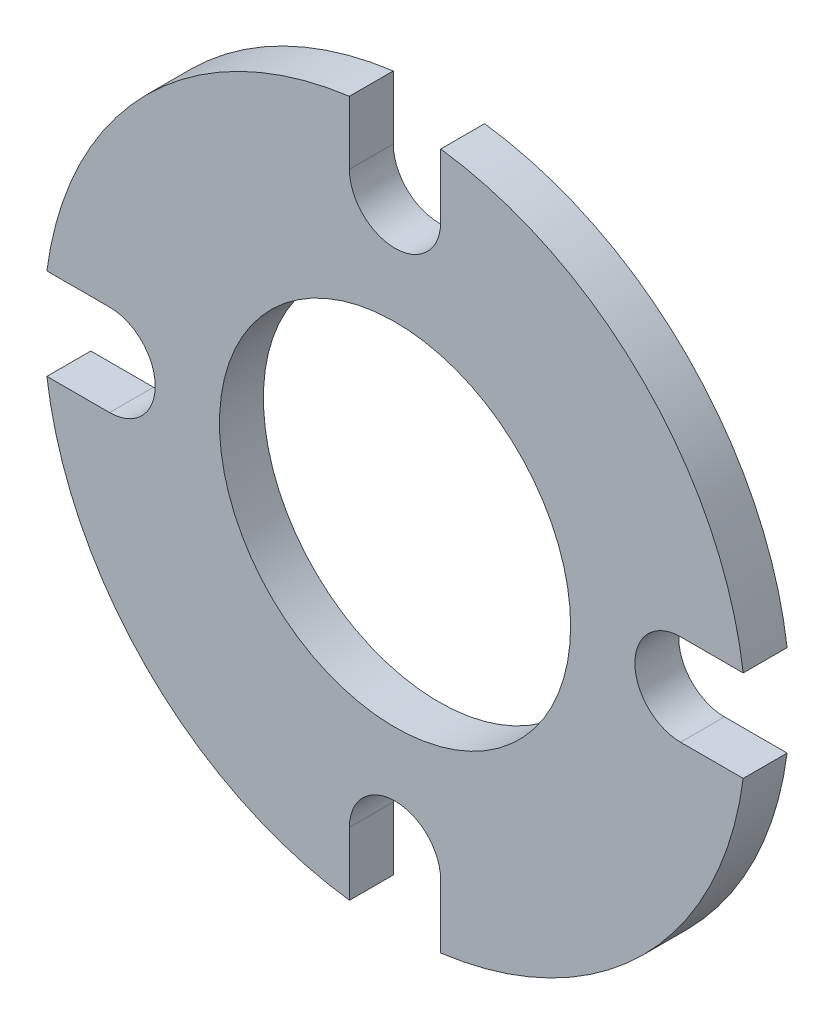
ISO-10303-21;
HEADER;
FILE_DESCRIPTION(('STEP AP214'),'2;1');
FILE_NAME('part.step','',(''),(''),'','','');
FILE_SCHEMA(('AUTOMOTIVE_DESIGN { 1 0 10303 214 1 1 1 1 }'));
ENDSEC;
DATA;
#1=APPLICATION_CONTEXT('core data for automotive mechanical design processes');
#2=APPLICATION_PROTOCOL_DEFINITION('international standard','automotive_design',2000,#1);
#3=PRODUCT_CONTEXT('',#1,'mechanical');
#4=PRODUCT('Part','Part','',(#3));
#5=PRODUCT_RELATED_PRODUCT_CATEGORY('part','',(#4));
#6=PRODUCT_DEFINITION_FORMATION('','',#4);
#7=PRODUCT_DEFINITION_CONTEXT('part definition',#1,'design');
#8=PRODUCT_DEFINITION('design','',#6,#7);
#9=PRODUCT_DEFINITION_SHAPE('','',#8);
#10=(LENGTH_UNIT() NAMED_UNIT(*) SI_UNIT(.MILLI.,.METRE.));
#11=(NAMED_UNIT(*) PLANE_ANGLE_UNIT() SI_UNIT($,.RADIAN.));
#12=(NAMED_UNIT(*) SI_UNIT($,.STERADIAN.) SOLID_ANGLE_UNIT());
#13=UNCERTAINTY_MEASURE_WITH_UNIT(LENGTH_MEASURE(1.E-05),#10,'distance_accuracy_value','');
#14=(GEOMETRIC_REPRESENTATION_CONTEXT(3) GLOBAL_UNCERTAINTY_ASSIGNED_CONTEXT((#13)) GLOBAL_UNIT_ASSIGNED_CONTEXT((#10,
#11,#12)) REPRESENTATION_CONTEXT('',''));
#15=CARTESIAN_POINT('',(0.,0.,0.));
#16=DIRECTION('',(0.,0.,1.));
#17=DIRECTION('',(1.,0.,0.));
#18=AXIS2_PLACEMENT_3D('',#15,#16,#17);
#19=CARTESIAN_POINT('',(-0.813,0.,0.0625));
#20=DIRECTION('',(0.,0.,-1.));
#21=DIRECTION('',(-1.,0.,0.));
#22=AXIS2_PLACEMENT_3D('',#19,#20,#21);
#23=PLANE('',#22);
#24=CARTESIAN_POINT('',(-0.813,0.,0.0625));
#25=DIRECTION('',(0.,0.,-1.));
#26=DIRECTION('',(-1.,0.,0.));
#27=AXIS2_PLACEMENT_3D('',#24,#25,#26);
#28=CIRCLE('',#27,0.13);
#29=CARTESIAN_POINT('',(-0.813,0.13,0.0625));
#30=VERTEX_POINT('',#29);
#31=CARTESIAN_POINT('',(-0.813,-0.13,0.0625));
#32=VERTEX_POINT('',#31);
#33=EDGE_CURVE('E213',#30,#32,#28,.T.);
#34=ORIENTED_EDGE('',*,*,#33,.T.);
#35=DIRECTION('',(-1.,0.,0.));
#36=VECTOR('',#35,1.);
#37=CARTESIAN_POINT('',(-0.813,-0.13,0.0625));
#38=LINE('',#37,#36);
#39=CARTESIAN_POINT('',(-0.991513993849809,-0.13,0.0625));
#40=VERTEX_POINT('',#39);
#41=EDGE_CURVE('E121',#32,#40,#38,.T.);
#42=ORIENTED_EDGE('',*,*,#41,.T.);
#43=CARTESIAN_POINT('',(0.,0.,0.0625));
#44=DIRECTION('',(0.,0.,1.));
#45=DIRECTION('',(1.,0.,0.));
#46=AXIS2_PLACEMENT_3D('',#43,#44,#45);
#47=CIRCLE('',#46,1.);
#48=CARTESIAN_POINT('',(-0.130000000000001,-0.991513993849809,0.0625));
#49=VERTEX_POINT('',#48);
#50=EDGE_CURVE('E252',#40,#49,#47,.T.);
#51=ORIENTED_EDGE('',*,*,#50,.T.);
#52=DIRECTION('',(0.,1.,0.));
#53=VECTOR('',#52,1.);
#54=CARTESIAN_POINT('',(-0.13,-0.991513993849809,0.0625));
#55=LINE('',#54,#53);
#56=CARTESIAN_POINT('',(-0.13,-0.811513993849809,0.0625));
#57=VERTEX_POINT('',#56);
#58=EDGE_CURVE('E271',#49,#57,#55,.T.);
#59=ORIENTED_EDGE('',*,*,#58,.T.);
#60=CARTESIAN_POINT('',(0.,-0.811513993849809,0.0625));
#61=DIRECTION('',(0.,0.,-1.));
#62=DIRECTION('',(-1.,0.,0.));
#63=AXIS2_PLACEMENT_3D('',#60,#61,#62);
#64=CIRCLE('',#63,0.13);
#65=CARTESIAN_POINT('',(0.13,-0.811513993849809,0.0625));
#66=VERTEX_POINT('',#65);
#67=EDGE_CURVE('E268',#57,#66,#64,.T.);
#68=ORIENTED_EDGE('',*,*,#67,.T.);
#69=DIRECTION('',(0.,-1.,0.));
#70=VECTOR('',#69,1.);
#71=CARTESIAN_POINT('',(0.13,-0.991513993849809,0.0625));
#72=LINE('',#71,#70);
#73=CARTESIAN_POINT('',(0.13,-0.991513993849809,0.0625));
#74=VERTEX_POINT('',#73);
#75=EDGE_CURVE('E270',#66,#74,#72,.T.);
#76=ORIENTED_EDGE('',*,*,#75,.T.);
#77=CARTESIAN_POINT('',(0.,0.,0.0625));
#78=DIRECTION('',(0.,0.,1.));
#79=DIRECTION('',(1.,0.,0.));
#80=AXIS2_PLACEMENT_3D('',#77,#78,#79);
#81=CIRCLE('',#80,1.);
#82=CARTESIAN_POINT('',(0.991513993849809,-0.130000000000001,0.0625));
#83=VERTEX_POINT('',#82);
#84=EDGE_CURVE('E273',#74,#83,#81,.T.);
#85=ORIENTED_EDGE('',*,*,#84,.T.);
#86=DIRECTION('',(-1.,0.,0.));
#87=VECTOR('',#86,1.);
#88=CARTESIAN_POINT('',(0.813,-0.13,0.0625));
#89=LINE('',#88,#87);
#90=CARTESIAN_POINT('',(0.813,-0.13,0.0625));
#91=VERTEX_POINT('',#90);
#92=EDGE_CURVE('E279',#83,#91,#89,.T.);
#93=ORIENTED_EDGE('',*,*,#92,.T.);
#94=CARTESIAN_POINT('',(0.813,0.,0.0625));
#95=DIRECTION('',(0.,0.,-1.));
#96=DIRECTION('',(1.,0.,0.));
#97=AXIS2_PLACEMENT_3D('',#94,#95,#96);
#98=CIRCLE('',#97,0.13);
#99=CARTESIAN_POINT('',(0.813,0.13,0.0625));
#100=VERTEX_POINT('',#99);
#101=EDGE_CURVE('E281',#91,#100,#98,.T.);
#102=ORIENTED_EDGE('',*,*,#101,.T.);
#103=DIRECTION('',(1.,0.,0.));
#104=VECTOR('',#103,1.);
#105=CARTESIAN_POINT('',(0.99151399384981,0.13,0.0625));
#106=LINE('',#105,#104);
#107=CARTESIAN_POINT('',(0.99151399384981,0.13,0.0625));
#108=VERTEX_POINT('',#107);
#109=EDGE_CURVE('E283',#100,#108,#106,.T.);
#110=ORIENTED_EDGE('',*,*,#109,.T.);
#111=CARTESIAN_POINT('',(0.,0.,0.0625));
#112=DIRECTION('',(0.,0.,1.));
#113=DIRECTION('',(1.,0.,0.));
#114=AXIS2_PLACEMENT_3D('',#111,#112,#113);
#115=CIRCLE('',#114,1.);
#116=CARTESIAN_POINT('',(0.13,0.991513993849809,0.0625));
#117=VERTEX_POINT('',#116);
#118=EDGE_CURVE('E285',#108,#117,#115,.T.);
#119=ORIENTED_EDGE('',*,*,#118,.T.);
#120=DIRECTION('',(0.,-1.,0.));
#121=VECTOR('',#120,1.);
#122=CARTESIAN_POINT('',(0.13,0.991513993849809,0.0625));
#123=LINE('',#122,#121);
#124=CARTESIAN_POINT('',(0.13,0.811513993849809,0.0625));
#125=VERTEX_POINT('',#124);
#126=EDGE_CURVE('E287',#117,#125,#123,.T.);
#127=ORIENTED_EDGE('',*,*,#126,.T.);
#128=CARTESIAN_POINT('',(0.,0.811513993849809,0.0625));
#129=DIRECTION('',(0.,0.,-1.));
#130=DIRECTION('',(1.,0.,0.));
#131=AXIS2_PLACEMENT_3D('',#128,#129,#130);
#132=CIRCLE('',#131,0.13);
#133=CARTESIAN_POINT('',(-0.13,0.811513993849809,0.0625));
#134=VERTEX_POINT('',#133);
#135=EDGE_CURVE('E164',#125,#134,#132,.T.);
#136=ORIENTED_EDGE('',*,*,#135,.T.);
#137=DIRECTION('',(0.,1.,0.));
#138=VECTOR('',#137,1.);
#139=CARTESIAN_POINT('',(-0.13,0.991513993849809,0.0625));
#140=LINE('',#139,#138);
#141=CARTESIAN_POINT('',(-0.13,0.991513993849809,0.0625));
#142=VERTEX_POINT('',#141);
#143=EDGE_CURVE('E158',#134,#142,#140,.T.);
#144=ORIENTED_EDGE('',*,*,#143,.T.);
#145=CARTESIAN_POINT('',(0.,0.,0.0625));
#146=DIRECTION('',(0.,0.,1.));
#147=DIRECTION('',(1.,0.,0.));
#148=AXIS2_PLACEMENT_3D('',#145,#146,#147);
#149=CIRCLE('',#148,1.);
#150=CARTESIAN_POINT('',(-0.991513993849809,0.13,0.0625));
#151=VERTEX_POINT('',#150);
#152=EDGE_CURVE('E162',#142,#151,#149,.T.);
#153=ORIENTED_EDGE('',*,*,#152,.T.);
#154=DIRECTION('',(1.,0.,0.));
#155=VECTOR('',#154,1.);
#156=CARTESIAN_POINT('',(-0.99151399384981,0.13,0.0625));
#157=LINE('',#156,#155);
#158=EDGE_CURVE('E54',#151,#30,#157,.T.);
#159=ORIENTED_EDGE('',*,*,#158,.T.);
#160=EDGE_LOOP('',(#34,#42,#51,#59,#68,#76,#85,#93,#102,#110,#119,#127,#136,#144,#153,#159));
#161=FACE_BOUND('',#160,.T.);
#162=CARTESIAN_POINT('',(0.,0.,0.0625));
#163=DIRECTION('',(0.,0.,1.));
#164=DIRECTION('',(1.,0.,0.));
#165=AXIS2_PLACEMENT_3D('',#162,#163,#164);
#166=CIRCLE('',#165,0.5);
#167=CARTESIAN_POINT('',(0.5,0.,0.0625));
#168=VERTEX_POINT('',#167);
#169=EDGE_CURVE('E186',#168,#168,#166,.T.);
#170=ORIENTED_EDGE('',*,*,#169,.F.);
#171=EDGE_LOOP('',(#170));
#172=FACE_BOUND('',#171,.T.);
#173=ADVANCED_FACE('F37',(#161,#172),#23,.F.);
#174=CARTESIAN_POINT('',(-0.813,0.,-0.0625));
#175=DIRECTION('',(0.,0.,-1.));
#176=DIRECTION('',(-1.,0.,0.));
#177=AXIS2_PLACEMENT_3D('',#174,#175,#176);
#178=PLANE('',#177);
#179=CARTESIAN_POINT('',(-0.813,0.,-0.0625));
#180=DIRECTION('',(0.,0.,-1.));
#181=DIRECTION('',(-1.,0.,0.));
#182=AXIS2_PLACEMENT_3D('',#179,#180,#181);
#183=CIRCLE('',#182,0.13);
#184=CARTESIAN_POINT('',(-0.813,0.13,-0.0625));
#185=VERTEX_POINT('',#184);
#186=CARTESIAN_POINT('',(-0.813,-0.13,-0.0625));
#187=VERTEX_POINT('',#186);
#188=EDGE_CURVE('E182',#185,#187,#183,.T.);
#189=ORIENTED_EDGE('',*,*,#188,.F.);
#190=DIRECTION('',(1.,0.,0.));
#191=VECTOR('',#190,1.);
#192=CARTESIAN_POINT('',(-0.99151399384981,0.13,-0.0625));
#193=LINE('',#192,#191);
#194=CARTESIAN_POINT('',(-0.991513993849809,0.13,-0.0625));
#195=VERTEX_POINT('',#194);
#196=EDGE_CURVE('E113',#195,#185,#193,.T.);
#197=ORIENTED_EDGE('',*,*,#196,.F.);
#198=CARTESIAN_POINT('',(0.,0.,-0.0625));
#199=DIRECTION('',(0.,0.,1.));
#200=DIRECTION('',(1.,0.,0.));
#201=AXIS2_PLACEMENT_3D('',#198,#199,#200);
#202=CIRCLE('',#201,1.);
#203=CARTESIAN_POINT('',(-0.13,0.991513993849809,-0.0625));
#204=VERTEX_POINT('',#203);
#205=EDGE_CURVE('E107',#204,#195,#202,.T.);
#206=ORIENTED_EDGE('',*,*,#205,.F.);
#207=DIRECTION('',(0.,1.,0.));
#208=VECTOR('',#207,1.);
#209=CARTESIAN_POINT('',(-0.13,0.991513993849809,-0.0625));
#210=LINE('',#209,#208);
#211=CARTESIAN_POINT('',(-0.13,0.811513993849809,-0.0625));
#212=VERTEX_POINT('',#211);
#213=EDGE_CURVE('E172',#212,#204,#210,.T.);
#214=ORIENTED_EDGE('',*,*,#213,.F.);
#215=CARTESIAN_POINT('',(0.,0.811513993849809,-0.0625));
#216=DIRECTION('',(0.,0.,-1.));
#217=DIRECTION('',(1.,0.,0.));
#218=AXIS2_PLACEMENT_3D('',#215,#216,#217);
#219=CIRCLE('',#218,0.13);
#220=CARTESIAN_POINT('',(0.13,0.811513993849809,-0.0625));
#221=VERTEX_POINT('',#220);
#222=EDGE_CURVE('E208',#221,#212,#219,.T.);
#223=ORIENTED_EDGE('',*,*,#222,.F.);
#224=DIRECTION('',(0.,-1.,0.));
#225=VECTOR('',#224,1.);
#226=CARTESIAN_POINT('',(0.13,0.991513993849809,-0.0625));
#227=LINE('',#226,#225);
#228=CARTESIAN_POINT('',(0.13,0.991513993849809,-0.0625));
#229=VERTEX_POINT('',#228);
#230=EDGE_CURVE('E206',#229,#221,#227,.T.);
#231=ORIENTED_EDGE('',*,*,#230,.F.);
#232=CARTESIAN_POINT('',(0.,0.,-0.0625));
#233=DIRECTION('',(0.,0.,1.));
#234=DIRECTION('',(1.,0.,0.));
#235=AXIS2_PLACEMENT_3D('',#232,#233,#234);
#236=CIRCLE('',#235,1.);
#237=CARTESIAN_POINT('',(0.99151399384981,0.13,-0.0625));
#238=VERTEX_POINT('',#237);
#239=EDGE_CURVE('E204',#238,#229,#236,.T.);
#240=ORIENTED_EDGE('',*,*,#239,.F.);
#241=DIRECTION('',(1.,0.,0.));
#242=VECTOR('',#241,1.);
#243=CARTESIAN_POINT('',(0.99151399384981,0.13,-0.0625));
#244=LINE('',#243,#242);
#245=CARTESIAN_POINT('',(0.813,0.13,-0.0625));
#246=VERTEX_POINT('',#245);
#247=EDGE_CURVE('E202',#246,#238,#244,.T.);
#248=ORIENTED_EDGE('',*,*,#247,.F.);
#249=CARTESIAN_POINT('',(0.813,0.,-0.0625));
#250=DIRECTION('',(0.,0.,-1.));
#251=DIRECTION('',(1.,0.,0.));
#252=AXIS2_PLACEMENT_3D('',#249,#250,#251);
#253=CIRCLE('',#252,0.13);
#254=CARTESIAN_POINT('',(0.813,-0.13,-0.0625));
#255=VERTEX_POINT('',#254);
#256=EDGE_CURVE('E200',#255,#246,#253,.T.);
#257=ORIENTED_EDGE('',*,*,#256,.F.);
#258=DIRECTION('',(-1.,0.,0.));
#259=VECTOR('',#258,1.);
#260=CARTESIAN_POINT('',(0.813,-0.13,-0.0625));
#261=LINE('',#260,#259);
#262=CARTESIAN_POINT('',(0.991513993849809,-0.130000000000001,-0.0625));
#263=VERTEX_POINT('',#262);
#264=EDGE_CURVE('E198',#263,#255,#261,.T.);
#265=ORIENTED_EDGE('',*,*,#264,.F.);
#266=CARTESIAN_POINT('',(0.,0.,-0.0625));
#267=DIRECTION('',(0.,0.,1.));
#268=DIRECTION('',(1.,0.,0.));
#269=AXIS2_PLACEMENT_3D('',#266,#267,#268);
#270=CIRCLE('',#269,1.);
#271=CARTESIAN_POINT('',(0.13,-0.991513993849809,-0.0625));
#272=VERTEX_POINT('',#271);
#273=EDGE_CURVE('E196',#272,#263,#270,.T.);
#274=ORIENTED_EDGE('',*,*,#273,.F.);
#275=DIRECTION('',(0.,-1.,0.));
#276=VECTOR('',#275,1.);
#277=CARTESIAN_POINT('',(0.13,-0.991513993849809,-0.0625));
#278=LINE('',#277,#276);
#279=CARTESIAN_POINT('',(0.13,-0.811513993849809,-0.0625));
#280=VERTEX_POINT('',#279);
#281=EDGE_CURVE('E194',#280,#272,#278,.T.);
#282=ORIENTED_EDGE('',*,*,#281,.F.);
#283=CARTESIAN_POINT('',(0.,-0.811513993849809,-0.0625));
#284=DIRECTION('',(0.,0.,-1.));
#285=DIRECTION('',(-1.,0.,0.));
#286=AXIS2_PLACEMENT_3D('',#283,#284,#285);
#287=CIRCLE('',#286,0.13);
#288=CARTESIAN_POINT('',(-0.13,-0.811513993849809,-0.0625));
#289=VERTEX_POINT('',#288);
#290=EDGE_CURVE('E192',#289,#280,#287,.T.);
#291=ORIENTED_EDGE('',*,*,#290,.F.);
#292=DIRECTION('',(0.,1.,0.));
#293=VECTOR('',#292,1.);
#294=CARTESIAN_POINT('',(-0.13,-0.991513993849809,-0.0625));
#295=LINE('',#294,#293);
#296=CARTESIAN_POINT('',(-0.130000000000001,-0.991513993849809,-0.0625));
#297=VERTEX_POINT('',#296);
#298=EDGE_CURVE('E190',#297,#289,#295,.T.);
#299=ORIENTED_EDGE('',*,*,#298,.F.);
#300=CARTESIAN_POINT('',(0.,0.,-0.0625));
#301=DIRECTION('',(0.,0.,1.));
#302=DIRECTION('',(1.,0.,0.));
#303=AXIS2_PLACEMENT_3D('',#300,#301,#302);
#304=CIRCLE('',#303,1.);
#305=CARTESIAN_POINT('',(-0.991513993849809,-0.13,-0.0625));
#306=VERTEX_POINT('',#305);
#307=EDGE_CURVE('E188',#306,#297,#304,.T.);
#308=ORIENTED_EDGE('',*,*,#307,.F.);
#309=DIRECTION('',(-1.,0.,0.));
#310=VECTOR('',#309,1.);
#311=CARTESIAN_POINT('',(-0.813,-0.13,-0.0625));
#312=LINE('',#311,#310);
#313=EDGE_CURVE('E185',#187,#306,#312,.T.);
#314=ORIENTED_EDGE('',*,*,#313,.F.);
#315=EDGE_LOOP('',(#189,#197,#206,#214,#223,#231,#240,#248,#257,#265,#274,#282,#291,#299,#308,#314));
#316=FACE_BOUND('',#315,.T.);
#317=CARTESIAN_POINT('',(0.,0.,-0.0625));
#318=DIRECTION('',(0.,0.,1.));
#319=DIRECTION('',(1.,0.,0.));
#320=AXIS2_PLACEMENT_3D('',#317,#318,#319);
#321=CIRCLE('',#320,0.5);
#322=CARTESIAN_POINT('',(0.5,0.,-0.0625));
#323=VERTEX_POINT('',#322);
#324=EDGE_CURVE('E524',#323,#323,#321,.T.);
#325=ORIENTED_EDGE('',*,*,#324,.T.);
#326=EDGE_LOOP('',(#325));
#327=FACE_BOUND('',#326,.T.);
#328=ADVANCED_FACE('F256',(#316,#327),#178,.T.);
#329=CARTESIAN_POINT('',(-0.813,0.,0.0625));
#330=DIRECTION('',(0.,0.,-1.));
#331=DIRECTION('',(-1.,0.,0.));
#332=AXIS2_PLACEMENT_3D('',#329,#330,#331);
#333=CYLINDRICAL_SURFACE('',#332,0.13);
#334=ORIENTED_EDGE('',*,*,#188,.T.);
#335=DIRECTION('',(0.,0.,-1.));
#336=VECTOR('',#335,1.);
#337=CARTESIAN_POINT('',(-0.813,-0.13,0.0625));
#338=LINE('',#337,#336);
#339=EDGE_CURVE('E11',#32,#187,#338,.T.);
#340=ORIENTED_EDGE('',*,*,#339,.F.);
#341=ORIENTED_EDGE('',*,*,#33,.F.);
#342=DIRECTION('',(0.,0.,-1.));
#343=VECTOR('',#342,1.);
#344=CARTESIAN_POINT('',(-0.813,0.13,0.0625));
#345=LINE('',#344,#343);
#346=EDGE_CURVE('E178',#30,#185,#345,.T.);
#347=ORIENTED_EDGE('',*,*,#346,.T.);
#348=EDGE_LOOP('',(#334,#340,#341,#347));
#349=FACE_BOUND('',#348,.T.);
#350=ADVANCED_FACE('F39',(#349),#333,.F.);
#351=CARTESIAN_POINT('',(-0.813,-0.13,0.0625));
#352=DIRECTION('',(0.,-1.,0.));
#353=DIRECTION('',(0.,0.,-1.));
#354=AXIS2_PLACEMENT_3D('',#351,#352,#353);
#355=PLANE('',#354);
#356=ORIENTED_EDGE('',*,*,#313,.T.);
#357=DIRECTION('',(0.,0.,-1.));
#358=VECTOR('',#357,1.);
#359=CARTESIAN_POINT('',(-0.991513993849809,-0.13,0.0625));
#360=LINE('',#359,#358);
#361=EDGE_CURVE('E46',#40,#306,#360,.T.);
#362=ORIENTED_EDGE('',*,*,#361,.F.);
#363=ORIENTED_EDGE('',*,*,#41,.F.);
#364=ORIENTED_EDGE('',*,*,#339,.T.);
#365=EDGE_LOOP('',(#356,#362,#363,#364));
#366=FACE_BOUND('',#365,.T.);
#367=ADVANCED_FACE('F321',(#366),#355,.F.);
#368=CARTESIAN_POINT('',(0.,0.,0.0625));
#369=DIRECTION('',(0.,0.,-1.));
#370=DIRECTION('',(-1.,0.,0.));
#371=AXIS2_PLACEMENT_3D('',#368,#369,#370);
#372=CYLINDRICAL_SURFACE('',#371,1.);
#373=ORIENTED_EDGE('',*,*,#307,.T.);
#374=DIRECTION('',(0.,0.,-1.));
#375=VECTOR('',#374,1.);
#376=CARTESIAN_POINT('',(-0.130000000000001,-0.991513993849809,0.0625));
#377=LINE('',#376,#375);
#378=EDGE_CURVE('E244',#49,#297,#377,.T.);
#379=ORIENTED_EDGE('',*,*,#378,.F.);
#380=ORIENTED_EDGE('',*,*,#50,.F.);
#381=ORIENTED_EDGE('',*,*,#361,.T.);
#382=EDGE_LOOP('',(#373,#379,#380,#381));
#383=FACE_BOUND('',#382,.T.);
#384=ADVANCED_FACE('F250',(#383),#372,.T.);
#385=CARTESIAN_POINT('',(-0.13,-0.991513993849809,0.0625));
#386=DIRECTION('',(-1.,0.,0.));
#387=DIRECTION('',(0.,0.,1.));
#388=AXIS2_PLACEMENT_3D('',#385,#386,#387);
#389=PLANE('',#388);
#390=ORIENTED_EDGE('',*,*,#298,.T.);
#391=DIRECTION('',(0.,0.,-1.));
#392=VECTOR('',#391,1.);
#393=CARTESIAN_POINT('',(-0.13,-0.811513993849809,0.0625));
#394=LINE('',#393,#392);
#395=EDGE_CURVE('E241',#57,#289,#394,.T.);
#396=ORIENTED_EDGE('',*,*,#395,.F.);
#397=ORIENTED_EDGE('',*,*,#58,.F.);
#398=ORIENTED_EDGE('',*,*,#378,.T.);
#399=EDGE_LOOP('',(#390,#396,#397,#398));
#400=FACE_BOUND('',#399,.T.);
#401=ADVANCED_FACE('F262',(#400),#389,.F.);
#402=CARTESIAN_POINT('',(0.,-0.811513993849809,0.0625));
#403=DIRECTION('',(0.,0.,-1.));
#404=DIRECTION('',(-1.,0.,0.));
#405=AXIS2_PLACEMENT_3D('',#402,#403,#404);
#406=CYLINDRICAL_SURFACE('',#405,0.13);
#407=ORIENTED_EDGE('',*,*,#290,.T.);
#408=DIRECTION('',(0.,0.,-1.));
#409=VECTOR('',#408,1.);
#410=CARTESIAN_POINT('',(0.13,-0.811513993849809,0.0625));
#411=LINE('',#410,#409);
#412=EDGE_CURVE('E238',#66,#280,#411,.T.);
#413=ORIENTED_EDGE('',*,*,#412,.F.);
#414=ORIENTED_EDGE('',*,*,#67,.F.);
#415=ORIENTED_EDGE('',*,*,#395,.T.);
#416=EDGE_LOOP('',(#407,#413,#414,#415));
#417=FACE_BOUND('',#416,.T.);
#418=ADVANCED_FACE('F266',(#417),#406,.F.);
#419=CARTESIAN_POINT('',(0.13,-0.991513993849809,0.0625));
#420=DIRECTION('',(1.,0.,0.));
#421=DIRECTION('',(0.,0.,-1.));
#422=AXIS2_PLACEMENT_3D('',#419,#420,#421);
#423=PLANE('',#422);
#424=ORIENTED_EDGE('',*,*,#281,.T.);
#425=DIRECTION('',(0.,0.,-1.));
#426=VECTOR('',#425,1.);
#427=CARTESIAN_POINT('',(0.13,-0.991513993849809,0.0625));
#428=LINE('',#427,#426);
#429=EDGE_CURVE('E235',#74,#272,#428,.T.);
#430=ORIENTED_EDGE('',*,*,#429,.F.);
#431=ORIENTED_EDGE('',*,*,#75,.F.);
#432=ORIENTED_EDGE('',*,*,#412,.T.);
#433=EDGE_LOOP('',(#424,#430,#431,#432));
#434=FACE_BOUND('',#433,.T.);
#435=ADVANCED_FACE('F334',(#434),#423,.F.);
#436=CARTESIAN_POINT('',(0.,0.,0.0625));
#437=DIRECTION('',(0.,0.,-1.));
#438=DIRECTION('',(-1.,0.,0.));
#439=AXIS2_PLACEMENT_3D('',#436,#437,#438);
#440=CYLINDRICAL_SURFACE('',#439,1.);
#441=ORIENTED_EDGE('',*,*,#273,.T.);
#442=DIRECTION('',(0.,0.,-1.));
#443=VECTOR('',#442,1.);
#444=CARTESIAN_POINT('',(0.991513993849809,-0.130000000000001,0.0625));
#445=LINE('',#444,#443);
#446=EDGE_CURVE('E232',#83,#263,#445,.T.);
#447=ORIENTED_EDGE('',*,*,#446,.F.);
#448=ORIENTED_EDGE('',*,*,#84,.F.);
#449=ORIENTED_EDGE('',*,*,#429,.T.);
#450=EDGE_LOOP('',(#441,#447,#448,#449));
#451=FACE_BOUND('',#450,.T.);
#452=ADVANCED_FACE('F337',(#451),#440,.T.);
#453=CARTESIAN_POINT('',(0.813,-0.13,0.0625));
#454=DIRECTION('',(0.,-1.,0.));
#455=DIRECTION('',(0.,0.,-1.));
#456=AXIS2_PLACEMENT_3D('',#453,#454,#455);
#457=PLANE('',#456);
#458=ORIENTED_EDGE('',*,*,#264,.T.);
#459=DIRECTION('',(0.,0.,-1.));
#460=VECTOR('',#459,1.);
#461=CARTESIAN_POINT('',(0.813,-0.13,0.0625));
#462=LINE('',#461,#460);
#463=EDGE_CURVE('E229',#91,#255,#462,.T.);
#464=ORIENTED_EDGE('',*,*,#463,.F.);
#465=ORIENTED_EDGE('',*,*,#92,.F.);
#466=ORIENTED_EDGE('',*,*,#446,.T.);
#467=EDGE_LOOP('',(#458,#464,#465,#466));
#468=FACE_BOUND('',#467,.T.);
#469=ADVANCED_FACE('F341',(#468),#457,.F.);
#470=CARTESIAN_POINT('',(0.813,0.,0.0625));
#471=DIRECTION('',(0.,0.,-1.));
#472=DIRECTION('',(-1.,0.,0.));
#473=AXIS2_PLACEMENT_3D('',#470,#471,#472);
#474=CYLINDRICAL_SURFACE('',#473,0.13);
#475=ORIENTED_EDGE('',*,*,#256,.T.);
#476=DIRECTION('',(0.,0.,-1.));
#477=VECTOR('',#476,1.);
#478=CARTESIAN_POINT('',(0.813,0.13,0.0625));
#479=LINE('',#478,#477);
#480=EDGE_CURVE('E226',#100,#246,#479,.T.);
#481=ORIENTED_EDGE('',*,*,#480,.F.);
#482=ORIENTED_EDGE('',*,*,#101,.F.);
#483=ORIENTED_EDGE('',*,*,#463,.T.);
#484=EDGE_LOOP('',(#475,#481,#482,#483));
#485=FACE_BOUND('',#484,.T.);
#486=ADVANCED_FACE('F345',(#485),#474,.F.);
#487=CARTESIAN_POINT('',(0.99151399384981,0.13,0.0625));
#488=DIRECTION('',(0.,1.,0.));
#489=DIRECTION('',(-1.,0.,0.));
#490=AXIS2_PLACEMENT_3D('',#487,#488,#489);
#491=PLANE('',#490);
#492=ORIENTED_EDGE('',*,*,#247,.T.);
#493=DIRECTION('',(0.,0.,-1.));
#494=VECTOR('',#493,1.);
#495=CARTESIAN_POINT('',(0.99151399384981,0.13,0.0625));
#496=LINE('',#495,#494);
#497=EDGE_CURVE('E223',#108,#238,#496,.T.);
#498=ORIENTED_EDGE('',*,*,#497,.F.);
#499=ORIENTED_EDGE('',*,*,#109,.F.);
#500=ORIENTED_EDGE('',*,*,#480,.T.);
#501=EDGE_LOOP('',(#492,#498,#499,#500));
#502=FACE_BOUND('',#501,.T.);
#503=ADVANCED_FACE('F349',(#502),#491,.F.);
#504=CARTESIAN_POINT('',(0.,0.,0.0625));
#505=DIRECTION('',(0.,0.,-1.));
#506=DIRECTION('',(-1.,0.,0.));
#507=AXIS2_PLACEMENT_3D('',#504,#505,#506);
#508=CYLINDRICAL_SURFACE('',#507,1.);
#509=ORIENTED_EDGE('',*,*,#239,.T.);
#510=DIRECTION('',(0.,0.,-1.));
#511=VECTOR('',#510,1.);
#512=CARTESIAN_POINT('',(0.13,0.991513993849809,0.0625));
#513=LINE('',#512,#511);
#514=EDGE_CURVE('E220',#117,#229,#513,.T.);
#515=ORIENTED_EDGE('',*,*,#514,.F.);
#516=ORIENTED_EDGE('',*,*,#118,.F.);
#517=ORIENTED_EDGE('',*,*,#497,.T.);
#518=EDGE_LOOP('',(#509,#515,#516,#517));
#519=FACE_BOUND('',#518,.T.);
#520=ADVANCED_FACE('F353',(#519),#508,.T.);
#521=CARTESIAN_POINT('',(0.13,0.991513993849809,0.0625));
#522=DIRECTION('',(1.,0.,0.));
#523=DIRECTION('',(0.,0.,-1.));
#524=AXIS2_PLACEMENT_3D('',#521,#522,#523);
#525=PLANE('',#524);
#526=ORIENTED_EDGE('',*,*,#230,.T.);
#527=DIRECTION('',(0.,0.,-1.));
#528=VECTOR('',#527,1.);
#529=CARTESIAN_POINT('',(0.13,0.811513993849809,0.0625));
#530=LINE('',#529,#528);
#531=EDGE_CURVE('E217',#125,#221,#530,.T.);
#532=ORIENTED_EDGE('',*,*,#531,.F.);
#533=ORIENTED_EDGE('',*,*,#126,.F.);
#534=ORIENTED_EDGE('',*,*,#514,.T.);
#535=EDGE_LOOP('',(#526,#532,#533,#534));
#536=FACE_BOUND('',#535,.T.);
#537=ADVANCED_FACE('F293',(#536),#525,.F.);
#538=CARTESIAN_POINT('',(0.,0.811513993849809,0.0625));
#539=DIRECTION('',(0.,0.,-1.));
#540=DIRECTION('',(-1.,0.,0.));
#541=AXIS2_PLACEMENT_3D('',#538,#539,#540);
#542=CYLINDRICAL_SURFACE('',#541,0.13);
#543=ORIENTED_EDGE('',*,*,#222,.T.);
#544=DIRECTION('',(0.,0.,-1.));
#545=VECTOR('',#544,1.);
#546=CARTESIAN_POINT('',(-0.13,0.811513993849809,0.0625));
#547=LINE('',#546,#545);
#548=EDGE_CURVE('E173',#134,#212,#547,.T.);
#549=ORIENTED_EDGE('',*,*,#548,.F.);
#550=ORIENTED_EDGE('',*,*,#135,.F.);
#551=ORIENTED_EDGE('',*,*,#531,.T.);
#552=EDGE_LOOP('',(#543,#549,#550,#551));
#553=FACE_BOUND('',#552,.T.);
#554=ADVANCED_FACE('F297',(#553),#542,.F.);
#555=CARTESIAN_POINT('',(-0.13,0.991513993849809,0.0625));
#556=DIRECTION('',(-1.,0.,0.));
#557=DIRECTION('',(0.,0.,1.));
#558=AXIS2_PLACEMENT_3D('',#555,#556,#557);
#559=PLANE('',#558);
#560=ORIENTED_EDGE('',*,*,#213,.T.);
#561=DIRECTION('',(0.,0.,-1.));
#562=VECTOR('',#561,1.);
#563=CARTESIAN_POINT('',(-0.13,0.991513993849809,0.0625));
#564=LINE('',#563,#562);
#565=EDGE_CURVE('E169',#142,#204,#564,.T.);
#566=ORIENTED_EDGE('',*,*,#565,.F.);
#567=ORIENTED_EDGE('',*,*,#143,.F.);
#568=ORIENTED_EDGE('',*,*,#548,.T.);
#569=EDGE_LOOP('',(#560,#566,#567,#568));
#570=FACE_BOUND('',#569,.T.);
#571=ADVANCED_FACE('F170',(#570),#559,.F.);
#572=CARTESIAN_POINT('',(0.,0.,0.0625));
#573=DIRECTION('',(0.,0.,-1.));
#574=DIRECTION('',(-1.,0.,0.));
#575=AXIS2_PLACEMENT_3D('',#572,#573,#574);
#576=CYLINDRICAL_SURFACE('',#575,1.);
#577=ORIENTED_EDGE('',*,*,#205,.T.);
#578=DIRECTION('',(0.,0.,-1.));
#579=VECTOR('',#578,1.);
#580=CARTESIAN_POINT('',(-0.991513993849809,0.13,0.0625));
#581=LINE('',#580,#579);
#582=EDGE_CURVE('E174',#151,#195,#581,.T.);
#583=ORIENTED_EDGE('',*,*,#582,.F.);
#584=ORIENTED_EDGE('',*,*,#152,.F.);
#585=ORIENTED_EDGE('',*,*,#565,.T.);
#586=EDGE_LOOP('',(#577,#583,#584,#585));
#587=FACE_BOUND('',#586,.T.);
#588=ADVANCED_FACE('F176',(#587),#576,.T.);
#589=CARTESIAN_POINT('',(-0.99151399384981,0.13,0.0625));
#590=DIRECTION('',(0.,1.,0.));
#591=DIRECTION('',(-1.,0.,0.));
#592=AXIS2_PLACEMENT_3D('',#589,#590,#591);
#593=PLANE('',#592);
#594=ORIENTED_EDGE('',*,*,#196,.T.);
#595=ORIENTED_EDGE('',*,*,#346,.F.);
#596=ORIENTED_EDGE('',*,*,#158,.F.);
#597=ORIENTED_EDGE('',*,*,#582,.T.);
#598=EDGE_LOOP('',(#594,#595,#596,#597));
#599=FACE_BOUND('',#598,.T.);
#600=ADVANCED_FACE('F301',(#599),#593,.F.);
#601=CARTESIAN_POINT('',(0.,0.,0.0625));
#602=DIRECTION('',(0.,0.,-1.));
#603=DIRECTION('',(-1.,0.,0.));
#604=AXIS2_PLACEMENT_3D('',#601,#602,#603);
#605=CYLINDRICAL_SURFACE('',#604,0.5);
#606=ORIENTED_EDGE('',*,*,#169,.T.);
#607=EDGE_LOOP('',(#606));
#608=FACE_BOUND('',#607,.T.);
#609=ORIENTED_EDGE('',*,*,#324,.F.);
#610=EDGE_LOOP('',(#609));
#611=FACE_BOUND('',#610,.T.);
#612=ADVANCED_FACE('F303',(#608,#611),#605,.F.);
#613=CLOSED_SHELL('',(#173,#328,#350,#367,#384,#401,#418,#435,#452,#469,#486,#503,#520,#537,
#554,#571,#588,#600,#612));
#614=MANIFOLD_SOLID_BREP('B2',#613);
#615=ADVANCED_BREP_SHAPE_REPRESENTATION('',(#18,#614),#14);
#616=SHAPE_DEFINITION_REPRESENTATION(#9,#615);
ENDSEC;
END-ISO-10303-21;
